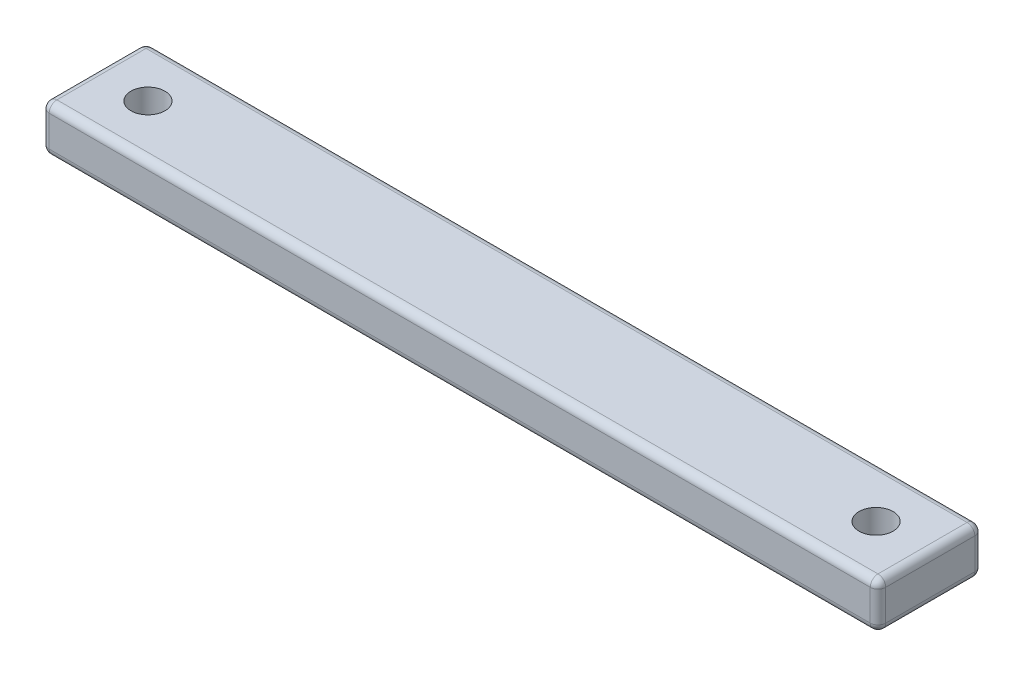
ISO-10303-21;
HEADER;
FILE_DESCRIPTION(('STEP AP214'),'2;1');
FILE_NAME('part.step','',(''),(''),'','','');
FILE_SCHEMA(('AUTOMOTIVE_DESIGN { 1 0 10303 214 1 1 1 1 }'));
ENDSEC;
DATA;
#1=APPLICATION_CONTEXT('core data for automotive mechanical design processes');
#2=APPLICATION_PROTOCOL_DEFINITION('international standard','automotive_design',2000,#1);
#3=PRODUCT_CONTEXT('',#1,'mechanical');
#4=PRODUCT('Part','Part','',(#3));
#5=PRODUCT_RELATED_PRODUCT_CATEGORY('part','',(#4));
#6=PRODUCT_DEFINITION_FORMATION('','',#4);
#7=PRODUCT_DEFINITION_CONTEXT('part definition',#1,'design');
#8=PRODUCT_DEFINITION('design','',#6,#7);
#9=PRODUCT_DEFINITION_SHAPE('','',#8);
#10=(LENGTH_UNIT() NAMED_UNIT(*) SI_UNIT(.MILLI.,.METRE.));
#11=(NAMED_UNIT(*) PLANE_ANGLE_UNIT() SI_UNIT($,.RADIAN.));
#12=(NAMED_UNIT(*) SI_UNIT($,.STERADIAN.) SOLID_ANGLE_UNIT());
#13=UNCERTAINTY_MEASURE_WITH_UNIT(LENGTH_MEASURE(1.E-05),#10,'distance_accuracy_value','');
#14=(GEOMETRIC_REPRESENTATION_CONTEXT(3) GLOBAL_UNCERTAINTY_ASSIGNED_CONTEXT((#13)) GLOBAL_UNIT_ASSIGNED_CONTEXT((#10,
#11,#12)) REPRESENTATION_CONTEXT('',''));
#15=CARTESIAN_POINT('',(0.,0.,0.));
#16=DIRECTION('',(0.,0.,1.));
#17=DIRECTION('',(1.,0.,0.));
#18=AXIS2_PLACEMENT_3D('',#15,#16,#17);
#19=CARTESIAN_POINT('',(0.,3.,0.));
#20=DIRECTION('',(0.,-1.,0.));
#21=DIRECTION('',(0.,0.,-1.));
#22=AXIS2_PLACEMENT_3D('',#19,#20,#21);
#23=PLANE('',#22);
#24=DIRECTION('',(1.,0.,0.));
#25=VECTOR('',#24,1.);
#26=CARTESIAN_POINT('',(0.,3.,2.875));
#27=LINE('',#26,#25);
#28=CARTESIAN_POINT('',(-26.5,3.,2.875));
#29=VERTEX_POINT('',#28);
#30=CARTESIAN_POINT('',(26.5,3.,2.875));
#31=VERTEX_POINT('',#30);
#32=EDGE_CURVE('E125',#29,#31,#27,.T.);
#33=ORIENTED_EDGE('',*,*,#32,.T.);
#34=DIRECTION('',(0.,0.,-1.));
#35=VECTOR('',#34,1.);
#36=CARTESIAN_POINT('',(26.5,3.,0.));
#37=LINE('',#36,#35);
#38=CARTESIAN_POINT('',(26.5,3.,-2.875));
#39=VERTEX_POINT('',#38);
#40=EDGE_CURVE('E164',#31,#39,#37,.T.);
#41=ORIENTED_EDGE('',*,*,#40,.T.);
#42=DIRECTION('',(-1.,0.,0.));
#43=VECTOR('',#42,1.);
#44=CARTESIAN_POINT('',(0.,3.,-2.875));
#45=LINE('',#44,#43);
#46=CARTESIAN_POINT('',(-26.5,3.,-2.875));
#47=VERTEX_POINT('',#46);
#48=EDGE_CURVE('E128',#39,#47,#45,.T.);
#49=ORIENTED_EDGE('',*,*,#48,.T.);
#50=DIRECTION('',(0.,0.,1.));
#51=VECTOR('',#50,1.);
#52=CARTESIAN_POINT('',(-26.5,3.,0.));
#53=LINE('',#52,#51);
#54=EDGE_CURVE('E120',#47,#29,#53,.T.);
#55=ORIENTED_EDGE('',*,*,#54,.T.);
#56=EDGE_LOOP('',(#33,#41,#49,#55));
#57=FACE_BOUND('',#56,.T.);
#58=CARTESIAN_POINT('',(-23.5,3.,0.));
#59=DIRECTION('',(0.,1.,0.));
#60=DIRECTION('',(0.,0.,1.));
#61=AXIS2_PLACEMENT_3D('',#58,#59,#60);
#62=CIRCLE('',#61,1.1);
#63=CARTESIAN_POINT('',(-23.5,3.,1.1));
#64=VERTEX_POINT('',#63);
#65=EDGE_CURVE('E156',#64,#64,#62,.T.);
#66=ORIENTED_EDGE('',*,*,#65,.F.);
#67=EDGE_LOOP('',(#66));
#68=FACE_BOUND('',#67,.T.);
#69=CARTESIAN_POINT('',(23.5,3.,0.));
#70=DIRECTION('',(0.,1.,0.));
#71=DIRECTION('',(0.,0.,1.));
#72=AXIS2_PLACEMENT_3D('',#69,#70,#71);
#73=CIRCLE('',#72,1.1);
#74=CARTESIAN_POINT('',(23.5,3.,1.1));
#75=VERTEX_POINT('',#74);
#76=EDGE_CURVE('E265',#75,#75,#73,.T.);
#77=ORIENTED_EDGE('',*,*,#76,.F.);
#78=EDGE_LOOP('',(#77));
#79=FACE_BOUND('',#78,.T.);
#80=ADVANCED_FACE('F33',(#57,#68,#79),#23,.F.);
#81=CARTESIAN_POINT('',(0.,0.,0.));
#82=DIRECTION('',(0.,-1.,0.));
#83=DIRECTION('',(0.,0.,-1.));
#84=AXIS2_PLACEMENT_3D('',#81,#82,#83);
#85=PLANE('',#84);
#86=DIRECTION('',(-1.,0.,0.));
#87=VECTOR('',#86,1.);
#88=CARTESIAN_POINT('',(27.,0.,-2.875));
#89=LINE('',#88,#87);
#90=CARTESIAN_POINT('',(-26.5,0.,-2.875));
#91=VERTEX_POINT('',#90);
#92=CARTESIAN_POINT('',(26.5,0.,-2.875));
#93=VERTEX_POINT('',#92);
#94=EDGE_CURVE('E179',#91,#93,#89,.F.);
#95=ORIENTED_EDGE('',*,*,#94,.T.);
#96=DIRECTION('',(0.,0.,-1.));
#97=VECTOR('',#96,1.);
#98=CARTESIAN_POINT('',(26.5,0.,3.375));
#99=LINE('',#98,#97);
#100=CARTESIAN_POINT('',(26.5,0.,2.875));
#101=VERTEX_POINT('',#100);
#102=EDGE_CURVE('E181',#93,#101,#99,.F.);
#103=ORIENTED_EDGE('',*,*,#102,.T.);
#104=DIRECTION('',(1.,0.,0.));
#105=VECTOR('',#104,1.);
#106=CARTESIAN_POINT('',(-27.,0.,2.875));
#107=LINE('',#106,#105);
#108=CARTESIAN_POINT('',(-26.5,0.,2.875));
#109=VERTEX_POINT('',#108);
#110=EDGE_CURVE('E175',#101,#109,#107,.F.);
#111=ORIENTED_EDGE('',*,*,#110,.T.);
#112=DIRECTION('',(0.,0.,1.));
#113=VECTOR('',#112,1.);
#114=CARTESIAN_POINT('',(-26.5,0.,-3.375));
#115=LINE('',#114,#113);
#116=EDGE_CURVE('E177',#109,#91,#115,.F.);
#117=ORIENTED_EDGE('',*,*,#116,.T.);
#118=EDGE_LOOP('',(#95,#103,#111,#117));
#119=FACE_BOUND('',#118,.T.);
#120=CARTESIAN_POINT('',(-23.5,0.,0.));
#121=DIRECTION('',(0.,1.,0.));
#122=DIRECTION('',(0.,0.,1.));
#123=AXIS2_PLACEMENT_3D('',#120,#121,#122);
#124=CIRCLE('',#123,1.1);
#125=CARTESIAN_POINT('',(-23.5,0.,1.1));
#126=VERTEX_POINT('',#125);
#127=EDGE_CURVE('E159',#126,#126,#124,.T.);
#128=ORIENTED_EDGE('',*,*,#127,.T.);
#129=EDGE_LOOP('',(#128));
#130=FACE_BOUND('',#129,.T.);
#131=CARTESIAN_POINT('',(23.5,0.,0.));
#132=DIRECTION('',(0.,1.,0.));
#133=DIRECTION('',(0.,0.,1.));
#134=AXIS2_PLACEMENT_3D('',#131,#132,#133);
#135=CIRCLE('',#134,1.1);
#136=CARTESIAN_POINT('',(23.5,0.,1.1));
#137=VERTEX_POINT('',#136);
#138=EDGE_CURVE('E259',#137,#137,#135,.T.);
#139=ORIENTED_EDGE('',*,*,#138,.T.);
#140=EDGE_LOOP('',(#139));
#141=FACE_BOUND('',#140,.T.);
#142=ADVANCED_FACE('F276',(#119,#130,#141),#85,.T.);
#143=CARTESIAN_POINT('',(27.,3.,3.375));
#144=DIRECTION('',(-1.,0.,0.));
#145=DIRECTION('',(0.,0.,1.));
#146=AXIS2_PLACEMENT_3D('',#143,#144,#145);
#147=PLANE('',#146);
#148=DIRECTION('',(0.,0.,-1.));
#149=VECTOR('',#148,1.);
#150=CARTESIAN_POINT('',(27.,0.5,-3.375));
#151=LINE('',#150,#149);
#152=CARTESIAN_POINT('',(27.,0.5,2.875));
#153=VERTEX_POINT('',#152);
#154=CARTESIAN_POINT('',(27.,0.5,-2.875));
#155=VERTEX_POINT('',#154);
#156=EDGE_CURVE('E168',#153,#155,#151,.T.);
#157=ORIENTED_EDGE('',*,*,#156,.T.);
#158=DIRECTION('',(0.,-1.,0.));
#159=VECTOR('',#158,1.);
#160=CARTESIAN_POINT('',(27.,3.,-2.875));
#161=LINE('',#160,#159);
#162=CARTESIAN_POINT('',(27.,2.5,-2.875));
#163=VERTEX_POINT('',#162);
#164=EDGE_CURVE('E173',#155,#163,#161,.F.);
#165=ORIENTED_EDGE('',*,*,#164,.T.);
#166=DIRECTION('',(0.,0.,-1.));
#167=VECTOR('',#166,1.);
#168=CARTESIAN_POINT('',(27.,2.5,3.375));
#169=LINE('',#168,#167);
#170=CARTESIAN_POINT('',(27.,2.5,2.875));
#171=VERTEX_POINT('',#170);
#172=EDGE_CURVE('E170',#163,#171,#169,.F.);
#173=ORIENTED_EDGE('',*,*,#172,.T.);
#174=DIRECTION('',(0.,-1.,0.));
#175=VECTOR('',#174,1.);
#176=CARTESIAN_POINT('',(27.,3.,2.875));
#177=LINE('',#176,#175);
#178=EDGE_CURVE('E166',#171,#153,#177,.T.);
#179=ORIENTED_EDGE('',*,*,#178,.T.);
#180=EDGE_LOOP('',(#157,#165,#173,#179));
#181=FACE_BOUND('',#180,.T.);
#182=ADVANCED_FACE('F296',(#181),#147,.F.);
#183=CARTESIAN_POINT('',(-27.,3.,-3.375));
#184=DIRECTION('',(0.,0.,1.));
#185=DIRECTION('',(1.,0.,0.));
#186=AXIS2_PLACEMENT_3D('',#183,#184,#185);
#187=PLANE('',#186);
#188=DIRECTION('',(-1.,0.,0.));
#189=VECTOR('',#188,1.);
#190=CARTESIAN_POINT('',(-27.,2.5,-3.375));
#191=LINE('',#190,#189);
#192=CARTESIAN_POINT('',(-26.5,2.5,-3.375));
#193=VERTEX_POINT('',#192);
#194=CARTESIAN_POINT('',(26.5,2.5,-3.375));
#195=VERTEX_POINT('',#194);
#196=EDGE_CURVE('E188',#193,#195,#191,.F.);
#197=ORIENTED_EDGE('',*,*,#196,.T.);
#198=DIRECTION('',(0.,-1.,0.));
#199=VECTOR('',#198,1.);
#200=CARTESIAN_POINT('',(26.5,3.,-3.375));
#201=LINE('',#200,#199);
#202=CARTESIAN_POINT('',(26.5,0.5,-3.375));
#203=VERTEX_POINT('',#202);
#204=EDGE_CURVE('E190',#195,#203,#201,.T.);
#205=ORIENTED_EDGE('',*,*,#204,.T.);
#206=DIRECTION('',(-1.,0.,0.));
#207=VECTOR('',#206,1.);
#208=CARTESIAN_POINT('',(-27.,0.5,-3.375));
#209=LINE('',#208,#207);
#210=CARTESIAN_POINT('',(-26.5,0.5,-3.375));
#211=VERTEX_POINT('',#210);
#212=EDGE_CURVE('E186',#203,#211,#209,.T.);
#213=ORIENTED_EDGE('',*,*,#212,.T.);
#214=DIRECTION('',(0.,-1.,0.));
#215=VECTOR('',#214,1.);
#216=CARTESIAN_POINT('',(-26.5,3.,-3.375));
#217=LINE('',#216,#215);
#218=EDGE_CURVE('E184',#211,#193,#217,.F.);
#219=ORIENTED_EDGE('',*,*,#218,.T.);
#220=EDGE_LOOP('',(#197,#205,#213,#219));
#221=FACE_BOUND('',#220,.T.);
#222=ADVANCED_FACE('F302',(#221),#187,.F.);
#223=CARTESIAN_POINT('',(-27.,3.,3.375));
#224=DIRECTION('',(1.,0.,0.));
#225=DIRECTION('',(0.,0.,-1.));
#226=AXIS2_PLACEMENT_3D('',#223,#224,#225);
#227=PLANE('',#226);
#228=DIRECTION('',(0.,0.,1.));
#229=VECTOR('',#228,1.);
#230=CARTESIAN_POINT('',(-27.,2.5,3.375));
#231=LINE('',#230,#229);
#232=CARTESIAN_POINT('',(-27.,2.5,2.875));
#233=VERTEX_POINT('',#232);
#234=CARTESIAN_POINT('',(-27.,2.5,-2.875));
#235=VERTEX_POINT('',#234);
#236=EDGE_CURVE('E138',#233,#235,#231,.F.);
#237=ORIENTED_EDGE('',*,*,#236,.T.);
#238=DIRECTION('',(0.,-1.,0.));
#239=VECTOR('',#238,1.);
#240=CARTESIAN_POINT('',(-27.,3.,-2.875));
#241=LINE('',#240,#239);
#242=CARTESIAN_POINT('',(-27.,0.5,-2.875));
#243=VERTEX_POINT('',#242);
#244=EDGE_CURVE('E198',#235,#243,#241,.T.);
#245=ORIENTED_EDGE('',*,*,#244,.T.);
#246=DIRECTION('',(0.,0.,1.));
#247=VECTOR('',#246,1.);
#248=CARTESIAN_POINT('',(-27.,0.5,3.375));
#249=LINE('',#248,#247);
#250=CARTESIAN_POINT('',(-27.,0.5,2.875));
#251=VERTEX_POINT('',#250);
#252=EDGE_CURVE('E195',#243,#251,#249,.T.);
#253=ORIENTED_EDGE('',*,*,#252,.T.);
#254=DIRECTION('',(0.,-1.,0.));
#255=VECTOR('',#254,1.);
#256=CARTESIAN_POINT('',(-27.,3.,2.875));
#257=LINE('',#256,#255);
#258=EDGE_CURVE('E193',#251,#233,#257,.F.);
#259=ORIENTED_EDGE('',*,*,#258,.T.);
#260=EDGE_LOOP('',(#237,#245,#253,#259));
#261=FACE_BOUND('',#260,.T.);
#262=ADVANCED_FACE('F289',(#261),#227,.F.);
#263=CARTESIAN_POINT('',(-27.,3.,3.375));
#264=DIRECTION('',(0.,0.,-1.));
#265=DIRECTION('',(-1.,0.,0.));
#266=AXIS2_PLACEMENT_3D('',#263,#264,#265);
#267=PLANE('',#266);
#268=DIRECTION('',(1.,0.,0.));
#269=VECTOR('',#268,1.);
#270=CARTESIAN_POINT('',(-27.,2.5,3.375));
#271=LINE('',#270,#269);
#272=CARTESIAN_POINT('',(26.5,2.5,3.375));
#273=VERTEX_POINT('',#272);
#274=CARTESIAN_POINT('',(-26.5,2.5,3.375));
#275=VERTEX_POINT('',#274);
#276=EDGE_CURVE('E42',#273,#275,#271,.F.);
#277=ORIENTED_EDGE('',*,*,#276,.T.);
#278=DIRECTION('',(0.,-1.,0.));
#279=VECTOR('',#278,1.);
#280=CARTESIAN_POINT('',(-26.5,3.,3.375));
#281=LINE('',#280,#279);
#282=CARTESIAN_POINT('',(-26.5,0.5,3.375));
#283=VERTEX_POINT('',#282);
#284=EDGE_CURVE('E11',#275,#283,#281,.T.);
#285=ORIENTED_EDGE('',*,*,#284,.T.);
#286=DIRECTION('',(1.,0.,0.));
#287=VECTOR('',#286,1.);
#288=CARTESIAN_POINT('',(27.,0.5,3.375));
#289=LINE('',#288,#287);
#290=CARTESIAN_POINT('',(26.5,0.5,3.375));
#291=VERTEX_POINT('',#290);
#292=EDGE_CURVE('E201',#283,#291,#289,.T.);
#293=ORIENTED_EDGE('',*,*,#292,.T.);
#294=DIRECTION('',(0.,-1.,0.));
#295=VECTOR('',#294,1.);
#296=CARTESIAN_POINT('',(26.5,3.,3.375));
#297=LINE('',#296,#295);
#298=EDGE_CURVE('E53',#291,#273,#297,.F.);
#299=ORIENTED_EDGE('',*,*,#298,.T.);
#300=EDGE_LOOP('',(#277,#285,#293,#299));
#301=FACE_BOUND('',#300,.T.);
#302=ADVANCED_FACE('F281',(#301),#267,.F.);
#303=CARTESIAN_POINT('',(-23.5,3.,0.));
#304=DIRECTION('',(0.,-1.,0.));
#305=DIRECTION('',(0.,0.,-1.));
#306=AXIS2_PLACEMENT_3D('',#303,#304,#305);
#307=CYLINDRICAL_SURFACE('',#306,1.1);
#308=ORIENTED_EDGE('',*,*,#65,.T.);
#309=EDGE_LOOP('',(#308));
#310=FACE_BOUND('',#309,.T.);
#311=ORIENTED_EDGE('',*,*,#127,.F.);
#312=EDGE_LOOP('',(#311));
#313=FACE_BOUND('',#312,.T.);
#314=ADVANCED_FACE('F278',(#310,#313),#307,.F.);
#315=CARTESIAN_POINT('',(23.5,3.,0.));
#316=DIRECTION('',(0.,-1.,0.));
#317=DIRECTION('',(0.,0.,-1.));
#318=AXIS2_PLACEMENT_3D('',#315,#316,#317);
#319=CYLINDRICAL_SURFACE('',#318,1.1);
#320=ORIENTED_EDGE('',*,*,#76,.T.);
#321=EDGE_LOOP('',(#320));
#322=FACE_BOUND('',#321,.T.);
#323=ORIENTED_EDGE('',*,*,#138,.F.);
#324=EDGE_LOOP('',(#323));
#325=FACE_BOUND('',#324,.T.);
#326=ADVANCED_FACE('F280',(#322,#325),#319,.F.);
#327=CARTESIAN_POINT('',(-26.5,0.5,3.375));
#328=DIRECTION('',(0.,0.,-1.));
#329=DIRECTION('',(-1.,0.,0.));
#330=AXIS2_PLACEMENT_3D('',#327,#328,#329);
#331=CYLINDRICAL_SURFACE('',#330,0.5);
#332=CARTESIAN_POINT('',(-26.5,0.5,2.875));
#333=DIRECTION('',(0.,0.,1.));
#334=DIRECTION('',(1.,0.,0.));
#335=AXIS2_PLACEMENT_3D('',#332,#333,#334);
#336=CIRCLE('',#335,0.5);
#337=EDGE_CURVE('E37',#251,#109,#336,.T.);
#338=ORIENTED_EDGE('',*,*,#337,.F.);
#339=ORIENTED_EDGE('',*,*,#252,.F.);
#340=CARTESIAN_POINT('',(-26.5,0.5,-2.875));
#341=DIRECTION('',(0.,0.,-1.));
#342=DIRECTION('',(-1.,0.,0.));
#343=AXIS2_PLACEMENT_3D('',#340,#341,#342);
#344=CIRCLE('',#343,0.5);
#345=EDGE_CURVE('E251',#91,#243,#344,.T.);
#346=ORIENTED_EDGE('',*,*,#345,.F.);
#347=ORIENTED_EDGE('',*,*,#116,.F.);
#348=EDGE_LOOP('',(#338,#339,#346,#347));
#349=FACE_BOUND('',#348,.T.);
#350=ADVANCED_FACE('F35',(#349),#331,.T.);
#351=CARTESIAN_POINT('',(-26.5,0.5,2.875));
#352=DIRECTION('',(0.,-1.,0.));
#353=DIRECTION('',(0.,0.,-1.));
#354=AXIS2_PLACEMENT_3D('',#351,#352,#353);
#355=SPHERICAL_SURFACE('',#354,0.5);
#356=CARTESIAN_POINT('',(-26.5,0.5,2.875));
#357=DIRECTION('',(0.,-1.,0.));
#358=DIRECTION('',(0.,0.,-1.));
#359=AXIS2_PLACEMENT_3D('',#356,#357,#358);
#360=CIRCLE('',#359,0.5);
#361=EDGE_CURVE('E246',#251,#283,#360,.F.);
#362=ORIENTED_EDGE('',*,*,#361,.F.);
#363=ORIENTED_EDGE('',*,*,#337,.T.);
#364=CARTESIAN_POINT('',(-26.5,0.5,2.875));
#365=DIRECTION('',(-1.,0.,0.));
#366=DIRECTION('',(0.,0.,1.));
#367=AXIS2_PLACEMENT_3D('',#364,#365,#366);
#368=CIRCLE('',#367,0.5);
#369=EDGE_CURVE('E249',#283,#109,#368,.F.);
#370=ORIENTED_EDGE('',*,*,#369,.F.);
#371=EDGE_LOOP('',(#362,#363,#370));
#372=FACE_BOUND('',#371,.T.);
#373=ADVANCED_FACE('F374',(#372),#355,.T.);
#374=CARTESIAN_POINT('',(-26.5,0.5,-2.875));
#375=DIRECTION('',(-1.,0.,0.));
#376=DIRECTION('',(0.,0.,1.));
#377=AXIS2_PLACEMENT_3D('',#374,#375,#376);
#378=SPHERICAL_SURFACE('',#377,0.5);
#379=CARTESIAN_POINT('',(-26.5,0.5,-2.875));
#380=DIRECTION('',(-1.,0.,0.));
#381=DIRECTION('',(0.,0.,1.));
#382=AXIS2_PLACEMENT_3D('',#379,#380,#381);
#383=CIRCLE('',#382,0.5);
#384=EDGE_CURVE('E241',#91,#211,#383,.F.);
#385=ORIENTED_EDGE('',*,*,#384,.F.);
#386=ORIENTED_EDGE('',*,*,#345,.T.);
#387=CARTESIAN_POINT('',(-26.5,0.5,-2.875));
#388=DIRECTION('',(0.,-1.,0.));
#389=DIRECTION('',(0.,0.,-1.));
#390=AXIS2_PLACEMENT_3D('',#387,#388,#389);
#391=CIRCLE('',#390,0.5);
#392=EDGE_CURVE('E244',#211,#243,#391,.F.);
#393=ORIENTED_EDGE('',*,*,#392,.F.);
#394=EDGE_LOOP('',(#385,#386,#393));
#395=FACE_BOUND('',#394,.T.);
#396=ADVANCED_FACE('F371',(#395),#378,.T.);
#397=CARTESIAN_POINT('',(-27.,0.5,2.875));
#398=DIRECTION('',(-1.,0.,0.));
#399=DIRECTION('',(0.,0.,1.));
#400=AXIS2_PLACEMENT_3D('',#397,#398,#399);
#401=CYLINDRICAL_SURFACE('',#400,0.5);
#402=ORIENTED_EDGE('',*,*,#369,.T.);
#403=ORIENTED_EDGE('',*,*,#110,.F.);
#404=CARTESIAN_POINT('',(26.5,0.5,2.875));
#405=DIRECTION('',(1.,0.,0.));
#406=DIRECTION('',(0.,0.,-1.));
#407=AXIS2_PLACEMENT_3D('',#404,#405,#406);
#408=CIRCLE('',#407,0.5);
#409=EDGE_CURVE('E236',#291,#101,#408,.T.);
#410=ORIENTED_EDGE('',*,*,#409,.F.);
#411=ORIENTED_EDGE('',*,*,#292,.F.);
#412=EDGE_LOOP('',(#402,#403,#410,#411));
#413=FACE_BOUND('',#412,.T.);
#414=ADVANCED_FACE('F367',(#413),#401,.T.);
#415=CARTESIAN_POINT('',(-26.5,3.,2.875));
#416=DIRECTION('',(0.,-1.,0.));
#417=DIRECTION('',(0.,0.,-1.));
#418=AXIS2_PLACEMENT_3D('',#415,#416,#417);
#419=CYLINDRICAL_SURFACE('',#418,0.5);
#420=ORIENTED_EDGE('',*,*,#361,.T.);
#421=ORIENTED_EDGE('',*,*,#284,.F.);
#422=CARTESIAN_POINT('',(-26.5,2.5,2.875));
#423=DIRECTION('',(0.,1.,0.));
#424=DIRECTION('',(0.,0.,1.));
#425=AXIS2_PLACEMENT_3D('',#422,#423,#424);
#426=CIRCLE('',#425,0.5);
#427=EDGE_CURVE('E142',#233,#275,#426,.T.);
#428=ORIENTED_EDGE('',*,*,#427,.F.);
#429=ORIENTED_EDGE('',*,*,#258,.F.);
#430=EDGE_LOOP('',(#420,#421,#428,#429));
#431=FACE_BOUND('',#430,.T.);
#432=ADVANCED_FACE('F364',(#431),#419,.T.);
#433=CARTESIAN_POINT('',(-26.5,2.5,0.));
#434=DIRECTION('',(0.,0.,1.));
#435=DIRECTION('',(1.,0.,0.));
#436=AXIS2_PLACEMENT_3D('',#433,#434,#435);
#437=CYLINDRICAL_SURFACE('',#436,0.5);
#438=CARTESIAN_POINT('',(-26.5,2.5,-2.875));
#439=DIRECTION('',(0.,0.,-1.));
#440=DIRECTION('',(0.,1.,0.));
#441=AXIS2_PLACEMENT_3D('',#438,#439,#440);
#442=CIRCLE('',#441,0.5);
#443=EDGE_CURVE('E143',#235,#47,#442,.T.);
#444=ORIENTED_EDGE('',*,*,#443,.F.);
#445=ORIENTED_EDGE('',*,*,#236,.F.);
#446=CARTESIAN_POINT('',(-26.5,2.5,2.875));
#447=DIRECTION('',(0.,0.,1.));
#448=DIRECTION('',(1.,0.,0.));
#449=AXIS2_PLACEMENT_3D('',#446,#447,#448);
#450=CIRCLE('',#449,0.5);
#451=EDGE_CURVE('E135',#29,#233,#450,.T.);
#452=ORIENTED_EDGE('',*,*,#451,.F.);
#453=ORIENTED_EDGE('',*,*,#54,.F.);
#454=EDGE_LOOP('',(#444,#445,#452,#453));
#455=FACE_BOUND('',#454,.T.);
#456=ADVANCED_FACE('F137',(#455),#437,.T.);
#457=CARTESIAN_POINT('',(-26.5,3.,-2.875));
#458=DIRECTION('',(0.,-1.,0.));
#459=DIRECTION('',(0.,0.,-1.));
#460=AXIS2_PLACEMENT_3D('',#457,#458,#459);
#461=CYLINDRICAL_SURFACE('',#460,0.5);
#462=ORIENTED_EDGE('',*,*,#392,.T.);
#463=ORIENTED_EDGE('',*,*,#244,.F.);
#464=CARTESIAN_POINT('',(-26.5,2.5,-2.875));
#465=DIRECTION('',(0.,1.,0.));
#466=DIRECTION('',(0.,0.,1.));
#467=AXIS2_PLACEMENT_3D('',#464,#465,#466);
#468=CIRCLE('',#467,0.5);
#469=EDGE_CURVE('E231',#193,#235,#468,.T.);
#470=ORIENTED_EDGE('',*,*,#469,.F.);
#471=ORIENTED_EDGE('',*,*,#218,.F.);
#472=EDGE_LOOP('',(#462,#463,#470,#471));
#473=FACE_BOUND('',#472,.T.);
#474=ADVANCED_FACE('F357',(#473),#461,.T.);
#475=CARTESIAN_POINT('',(-27.,0.5,-2.875));
#476=DIRECTION('',(1.,0.,0.));
#477=DIRECTION('',(0.,0.,-1.));
#478=AXIS2_PLACEMENT_3D('',#475,#476,#477);
#479=CYLINDRICAL_SURFACE('',#478,0.5);
#480=ORIENTED_EDGE('',*,*,#384,.T.);
#481=ORIENTED_EDGE('',*,*,#212,.F.);
#482=CARTESIAN_POINT('',(26.5,0.5,-2.875));
#483=DIRECTION('',(1.,0.,0.));
#484=DIRECTION('',(0.,0.,-1.));
#485=AXIS2_PLACEMENT_3D('',#482,#483,#484);
#486=CIRCLE('',#485,0.5);
#487=EDGE_CURVE('E228',#93,#203,#486,.T.);
#488=ORIENTED_EDGE('',*,*,#487,.F.);
#489=ORIENTED_EDGE('',*,*,#94,.F.);
#490=EDGE_LOOP('',(#480,#481,#488,#489));
#491=FACE_BOUND('',#490,.T.);
#492=ADVANCED_FACE('F353',(#491),#479,.T.);
#493=CARTESIAN_POINT('',(26.5,0.5,3.375));
#494=DIRECTION('',(0.,0.,1.));
#495=DIRECTION('',(1.,0.,0.));
#496=AXIS2_PLACEMENT_3D('',#493,#494,#495);
#497=CYLINDRICAL_SURFACE('',#496,0.5);
#498=CARTESIAN_POINT('',(26.5,0.5,2.875));
#499=DIRECTION('',(0.,0.,1.));
#500=DIRECTION('',(1.,0.,0.));
#501=AXIS2_PLACEMENT_3D('',#498,#499,#500);
#502=CIRCLE('',#501,0.5);
#503=EDGE_CURVE('E238',#101,#153,#502,.T.);
#504=ORIENTED_EDGE('',*,*,#503,.F.);
#505=ORIENTED_EDGE('',*,*,#102,.F.);
#506=CARTESIAN_POINT('',(26.5,0.5,-2.875));
#507=DIRECTION('',(0.,0.,-1.));
#508=DIRECTION('',(-1.,0.,0.));
#509=AXIS2_PLACEMENT_3D('',#506,#507,#508);
#510=CIRCLE('',#509,0.5);
#511=EDGE_CURVE('E225',#155,#93,#510,.T.);
#512=ORIENTED_EDGE('',*,*,#511,.F.);
#513=ORIENTED_EDGE('',*,*,#156,.F.);
#514=EDGE_LOOP('',(#504,#505,#512,#513));
#515=FACE_BOUND('',#514,.T.);
#516=ADVANCED_FACE('F349',(#515),#497,.T.);
#517=CARTESIAN_POINT('',(26.5,0.5,2.875));
#518=DIRECTION('',(0.,-1.,0.));
#519=DIRECTION('',(0.,0.,-1.));
#520=AXIS2_PLACEMENT_3D('',#517,#518,#519);
#521=SPHERICAL_SURFACE('',#520,0.5);
#522=ORIENTED_EDGE('',*,*,#409,.T.);
#523=ORIENTED_EDGE('',*,*,#503,.T.);
#524=CARTESIAN_POINT('',(26.5,0.5,2.875));
#525=DIRECTION('',(0.,-1.,0.));
#526=DIRECTION('',(0.,0.,-1.));
#527=AXIS2_PLACEMENT_3D('',#524,#525,#526);
#528=CIRCLE('',#527,0.5);
#529=EDGE_CURVE('E149',#291,#153,#528,.F.);
#530=ORIENTED_EDGE('',*,*,#529,.F.);
#531=EDGE_LOOP('',(#522,#523,#530));
#532=FACE_BOUND('',#531,.T.);
#533=ADVANCED_FACE('F346',(#532),#521,.T.);
#534=CARTESIAN_POINT('',(-26.5,2.5,2.875));
#535=DIRECTION('',(-1.,0.,0.));
#536=DIRECTION('',(0.,0.,1.));
#537=AXIS2_PLACEMENT_3D('',#534,#535,#536);
#538=SPHERICAL_SURFACE('',#537,0.5);
#539=ORIENTED_EDGE('',*,*,#451,.T.);
#540=ORIENTED_EDGE('',*,*,#427,.T.);
#541=CARTESIAN_POINT('',(-26.5,2.5,2.875));
#542=DIRECTION('',(-1.,0.,0.));
#543=DIRECTION('',(0.,0.,1.));
#544=AXIS2_PLACEMENT_3D('',#541,#542,#543);
#545=CIRCLE('',#544,0.5);
#546=EDGE_CURVE('E146',#29,#275,#545,.F.);
#547=ORIENTED_EDGE('',*,*,#546,.F.);
#548=EDGE_LOOP('',(#539,#540,#547));
#549=FACE_BOUND('',#548,.T.);
#550=ADVANCED_FACE('F147',(#549),#538,.T.);
#551=CARTESIAN_POINT('',(-26.5,2.5,-2.875));
#552=DIRECTION('',(-1.,0.,0.));
#553=DIRECTION('',(0.,0.,1.));
#554=AXIS2_PLACEMENT_3D('',#551,#552,#553);
#555=SPHERICAL_SURFACE('',#554,0.5);
#556=ORIENTED_EDGE('',*,*,#469,.T.);
#557=ORIENTED_EDGE('',*,*,#443,.T.);
#558=CARTESIAN_POINT('',(-26.5,2.5,-2.875));
#559=DIRECTION('',(-1.,0.,0.));
#560=DIRECTION('',(0.,0.,1.));
#561=AXIS2_PLACEMENT_3D('',#558,#559,#560);
#562=CIRCLE('',#561,0.5);
#563=EDGE_CURVE('E150',#193,#47,#562,.F.);
#564=ORIENTED_EDGE('',*,*,#563,.F.);
#565=EDGE_LOOP('',(#556,#557,#564));
#566=FACE_BOUND('',#565,.T.);
#567=ADVANCED_FACE('F339',(#566),#555,.T.);
#568=CARTESIAN_POINT('',(26.5,0.5,-2.875));
#569=DIRECTION('',(0.,-1.,0.));
#570=DIRECTION('',(0.,0.,-1.));
#571=AXIS2_PLACEMENT_3D('',#568,#569,#570);
#572=SPHERICAL_SURFACE('',#571,0.5);
#573=ORIENTED_EDGE('',*,*,#511,.T.);
#574=ORIENTED_EDGE('',*,*,#487,.T.);
#575=CARTESIAN_POINT('',(26.5,0.5,-2.875));
#576=DIRECTION('',(0.,-1.,0.));
#577=DIRECTION('',(0.,0.,-1.));
#578=AXIS2_PLACEMENT_3D('',#575,#576,#577);
#579=CIRCLE('',#578,0.5);
#580=EDGE_CURVE('E219',#155,#203,#579,.F.);
#581=ORIENTED_EDGE('',*,*,#580,.F.);
#582=EDGE_LOOP('',(#573,#574,#581));
#583=FACE_BOUND('',#582,.T.);
#584=ADVANCED_FACE('F335',(#583),#572,.T.);
#585=CARTESIAN_POINT('',(26.5,3.,2.875));
#586=DIRECTION('',(0.,-1.,0.));
#587=DIRECTION('',(0.,0.,-1.));
#588=AXIS2_PLACEMENT_3D('',#585,#586,#587);
#589=CYLINDRICAL_SURFACE('',#588,0.5);
#590=ORIENTED_EDGE('',*,*,#529,.T.);
#591=ORIENTED_EDGE('',*,*,#178,.F.);
#592=CARTESIAN_POINT('',(26.5,2.5,2.875));
#593=DIRECTION('',(0.,1.,0.));
#594=DIRECTION('',(0.,0.,1.));
#595=AXIS2_PLACEMENT_3D('',#592,#593,#594);
#596=CIRCLE('',#595,0.5);
#597=EDGE_CURVE('E216',#273,#171,#596,.T.);
#598=ORIENTED_EDGE('',*,*,#597,.F.);
#599=ORIENTED_EDGE('',*,*,#298,.F.);
#600=EDGE_LOOP('',(#590,#591,#598,#599));
#601=FACE_BOUND('',#600,.T.);
#602=ADVANCED_FACE('F332',(#601),#589,.T.);
#603=CARTESIAN_POINT('',(0.,2.5,2.875));
#604=DIRECTION('',(1.,0.,0.));
#605=DIRECTION('',(0.,0.,-1.));
#606=AXIS2_PLACEMENT_3D('',#603,#604,#605);
#607=CYLINDRICAL_SURFACE('',#606,0.5);
#608=ORIENTED_EDGE('',*,*,#546,.T.);
#609=ORIENTED_EDGE('',*,*,#276,.F.);
#610=CARTESIAN_POINT('',(26.5,2.5,2.875));
#611=DIRECTION('',(1.,0.,0.));
#612=DIRECTION('',(0.,0.,-1.));
#613=AXIS2_PLACEMENT_3D('',#610,#611,#612);
#614=CIRCLE('',#613,0.5);
#615=EDGE_CURVE('E154',#31,#273,#614,.T.);
#616=ORIENTED_EDGE('',*,*,#615,.F.);
#617=ORIENTED_EDGE('',*,*,#32,.F.);
#618=EDGE_LOOP('',(#608,#609,#616,#617));
#619=FACE_BOUND('',#618,.T.);
#620=ADVANCED_FACE('F152',(#619),#607,.T.);
#621=CARTESIAN_POINT('',(0.,2.5,-2.875));
#622=DIRECTION('',(-1.,0.,0.));
#623=DIRECTION('',(0.,0.,1.));
#624=AXIS2_PLACEMENT_3D('',#621,#622,#623);
#625=CYLINDRICAL_SURFACE('',#624,0.5);
#626=ORIENTED_EDGE('',*,*,#563,.T.);
#627=ORIENTED_EDGE('',*,*,#48,.F.);
#628=CARTESIAN_POINT('',(26.5,2.5,-2.875));
#629=DIRECTION('',(1.,0.,0.));
#630=DIRECTION('',(0.,0.,-1.));
#631=AXIS2_PLACEMENT_3D('',#628,#629,#630);
#632=CIRCLE('',#631,0.5);
#633=EDGE_CURVE('E212',#195,#39,#632,.T.);
#634=ORIENTED_EDGE('',*,*,#633,.F.);
#635=ORIENTED_EDGE('',*,*,#196,.F.);
#636=EDGE_LOOP('',(#626,#627,#634,#635));
#637=FACE_BOUND('',#636,.T.);
#638=ADVANCED_FACE('F325',(#637),#625,.T.);
#639=CARTESIAN_POINT('',(26.5,3.,-2.875));
#640=DIRECTION('',(0.,-1.,0.));
#641=DIRECTION('',(0.,0.,-1.));
#642=AXIS2_PLACEMENT_3D('',#639,#640,#641);
#643=CYLINDRICAL_SURFACE('',#642,0.5);
#644=ORIENTED_EDGE('',*,*,#580,.T.);
#645=ORIENTED_EDGE('',*,*,#204,.F.);
#646=CARTESIAN_POINT('',(26.5,2.5,-2.875));
#647=DIRECTION('',(0.,1.,0.));
#648=DIRECTION('',(0.,0.,1.));
#649=AXIS2_PLACEMENT_3D('',#646,#647,#648);
#650=CIRCLE('',#649,0.5);
#651=EDGE_CURVE('E209',#163,#195,#650,.T.);
#652=ORIENTED_EDGE('',*,*,#651,.F.);
#653=ORIENTED_EDGE('',*,*,#164,.F.);
#654=EDGE_LOOP('',(#644,#645,#652,#653));
#655=FACE_BOUND('',#654,.T.);
#656=ADVANCED_FACE('F321',(#655),#643,.T.);
#657=CARTESIAN_POINT('',(26.5,2.5,2.875));
#658=DIRECTION('',(0.,0.,1.));
#659=DIRECTION('',(1.,0.,0.));
#660=AXIS2_PLACEMENT_3D('',#657,#658,#659);
#661=SPHERICAL_SURFACE('',#660,0.5);
#662=ORIENTED_EDGE('',*,*,#615,.T.);
#663=ORIENTED_EDGE('',*,*,#597,.T.);
#664=CARTESIAN_POINT('',(26.5,2.5,2.875));
#665=DIRECTION('',(0.,0.,1.));
#666=DIRECTION('',(1.,0.,0.));
#667=AXIS2_PLACEMENT_3D('',#664,#665,#666);
#668=CIRCLE('',#667,0.5);
#669=EDGE_CURVE('E207',#31,#171,#668,.F.);
#670=ORIENTED_EDGE('',*,*,#669,.F.);
#671=EDGE_LOOP('',(#662,#663,#670));
#672=FACE_BOUND('',#671,.T.);
#673=ADVANCED_FACE('F317',(#672),#661,.T.);
#674=CARTESIAN_POINT('',(26.5,2.5,-2.875));
#675=DIRECTION('',(0.,0.,-1.));
#676=DIRECTION('',(-1.,0.,0.));
#677=AXIS2_PLACEMENT_3D('',#674,#675,#676);
#678=SPHERICAL_SURFACE('',#677,0.5);
#679=ORIENTED_EDGE('',*,*,#651,.T.);
#680=ORIENTED_EDGE('',*,*,#633,.T.);
#681=CARTESIAN_POINT('',(26.5,2.5,-2.875));
#682=DIRECTION('',(0.,0.,-1.));
#683=DIRECTION('',(-1.,0.,0.));
#684=AXIS2_PLACEMENT_3D('',#681,#682,#683);
#685=CIRCLE('',#684,0.5);
#686=EDGE_CURVE('E205',#163,#39,#685,.F.);
#687=ORIENTED_EDGE('',*,*,#686,.F.);
#688=EDGE_LOOP('',(#679,#680,#687));
#689=FACE_BOUND('',#688,.T.);
#690=ADVANCED_FACE('F313',(#689),#678,.T.);
#691=CARTESIAN_POINT('',(26.5,2.5,0.));
#692=DIRECTION('',(0.,0.,-1.));
#693=DIRECTION('',(-1.,0.,0.));
#694=AXIS2_PLACEMENT_3D('',#691,#692,#693);
#695=CYLINDRICAL_SURFACE('',#694,0.5);
#696=ORIENTED_EDGE('',*,*,#669,.T.);
#697=ORIENTED_EDGE('',*,*,#172,.F.);
#698=ORIENTED_EDGE('',*,*,#686,.T.);
#699=ORIENTED_EDGE('',*,*,#40,.F.);
#700=EDGE_LOOP('',(#696,#697,#698,#699));
#701=FACE_BOUND('',#700,.T.);
#702=ADVANCED_FACE('F310',(#701),#695,.T.);
#703=CLOSED_SHELL('',(#80,#142,#182,#222,#262,#302,#314,#326,#350,#373,#396,#414,#432,#456,#474,
#492,#516,#533,#550,#567,#584,#602,#620,#638,#656,#673,#690,#702));
#704=MANIFOLD_SOLID_BREP('B2',#703);
#705=ADVANCED_BREP_SHAPE_REPRESENTATION('',(#18,#704),#14);
#706=SHAPE_DEFINITION_REPRESENTATION(#9,#705);
ENDSEC;
END-ISO-10303-21;
